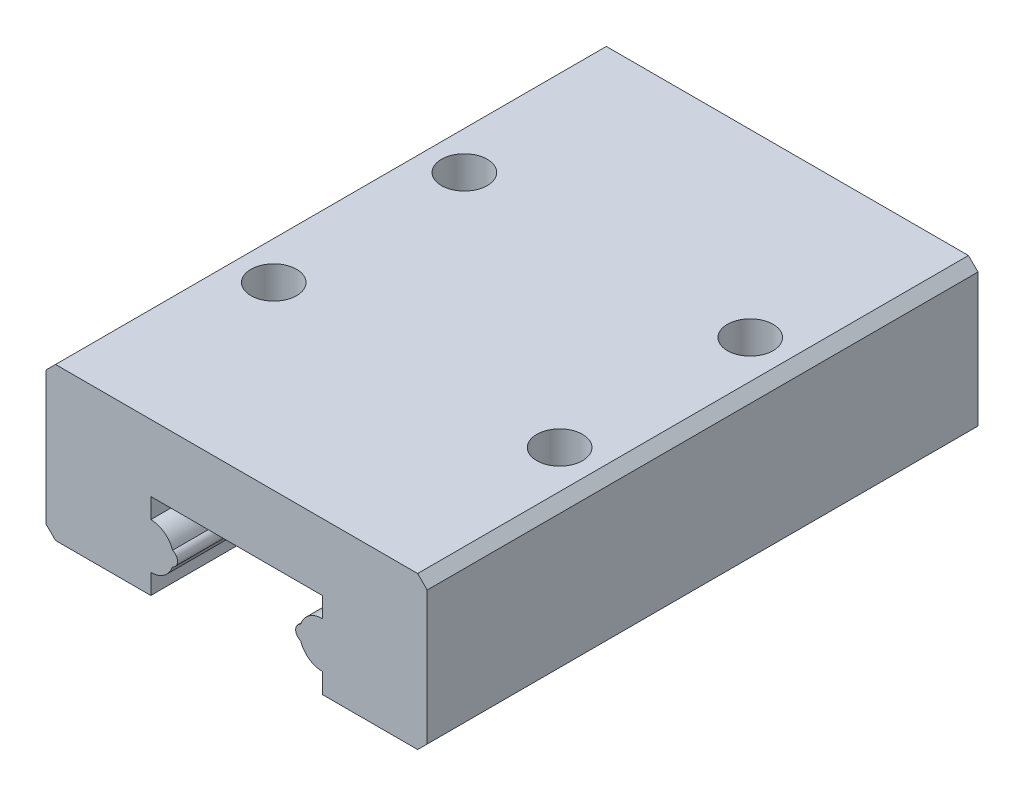
ISO-10303-21;
HEADER;
FILE_DESCRIPTION(('STEP AP214'),'2;1');
FILE_NAME('part.step','',(''),(''),'','','');
FILE_SCHEMA(('AUTOMOTIVE_DESIGN { 1 0 10303 214 1 1 1 1 }'));
ENDSEC;
DATA;
#1=APPLICATION_CONTEXT('core data for automotive mechanical design processes');
#2=APPLICATION_PROTOCOL_DEFINITION('international standard','automotive_design',2000,#1);
#3=PRODUCT_CONTEXT('',#1,'mechanical');
#4=PRODUCT('Part','Part','',(#3));
#5=PRODUCT_RELATED_PRODUCT_CATEGORY('part','',(#4));
#6=PRODUCT_DEFINITION_FORMATION('','',#4);
#7=PRODUCT_DEFINITION_CONTEXT('part definition',#1,'design');
#8=PRODUCT_DEFINITION('design','',#6,#7);
#9=PRODUCT_DEFINITION_SHAPE('','',#8);
#10=(LENGTH_UNIT() NAMED_UNIT(*) SI_UNIT(.MILLI.,.METRE.));
#11=(NAMED_UNIT(*) PLANE_ANGLE_UNIT() SI_UNIT($,.RADIAN.));
#12=(NAMED_UNIT(*) SI_UNIT($,.STERADIAN.) SOLID_ANGLE_UNIT());
#13=UNCERTAINTY_MEASURE_WITH_UNIT(LENGTH_MEASURE(1.E-05),#10,'distance_accuracy_value','');
#14=(GEOMETRIC_REPRESENTATION_CONTEXT(3) GLOBAL_UNCERTAINTY_ASSIGNED_CONTEXT((#13)) GLOBAL_UNIT_ASSIGNED_CONTEXT((#10,
#11,#12)) REPRESENTATION_CONTEXT('',''));
#15=CARTESIAN_POINT('',(0.,0.,0.));
#16=DIRECTION('',(0.,0.,1.));
#17=DIRECTION('',(1.,0.,0.));
#18=AXIS2_PLACEMENT_3D('',#15,#16,#17);
#19=CARTESIAN_POINT('',(-19.5,0.,-28.9));
#20=DIRECTION('',(0.707106781186547,0.707106781186548,0.));
#21=DIRECTION('',(-0.707106781186548,0.707106781186547,0.));
#22=AXIS2_PLACEMENT_3D('',#19,#20,#21);
#23=PLANE('',#22);
#24=DIRECTION('',(-0.707106781186548,0.707106781186547,0.));
#25=VECTOR('',#24,1.);
#26=CARTESIAN_POINT('',(-19.5,0.,0.));
#27=LINE('',#26,#25);
#28=CARTESIAN_POINT('',(-19.5,0.,0.));
#29=VERTEX_POINT('',#28);
#30=CARTESIAN_POINT('',(-20.,0.5,0.));
#31=VERTEX_POINT('',#30);
#32=EDGE_CURVE('E210',#29,#31,#27,.T.);
#33=ORIENTED_EDGE('',*,*,#32,.T.);
#34=DIRECTION('',(0.,0.,1.));
#35=VECTOR('',#34,1.);
#36=CARTESIAN_POINT('',(-20.,0.5,-28.9));
#37=LINE('',#36,#35);
#38=CARTESIAN_POINT('',(-20.,0.5,-28.9));
#39=VERTEX_POINT('',#38);
#40=EDGE_CURVE('E11',#39,#31,#37,.T.);
#41=ORIENTED_EDGE('',*,*,#40,.F.);
#42=DIRECTION('',(-0.707106781186548,0.707106781186547,0.));
#43=VECTOR('',#42,1.);
#44=CARTESIAN_POINT('',(-19.5,0.,-28.9));
#45=LINE('',#44,#43);
#46=CARTESIAN_POINT('',(-19.5,0.,-28.9));
#47=VERTEX_POINT('',#46);
#48=EDGE_CURVE('E260',#47,#39,#45,.T.);
#49=ORIENTED_EDGE('',*,*,#48,.F.);
#50=DIRECTION('',(0.,0.,1.));
#51=VECTOR('',#50,1.);
#52=CARTESIAN_POINT('',(-19.5,0.,-28.9));
#53=LINE('',#52,#51);
#54=EDGE_CURVE('E206',#47,#29,#53,.T.);
#55=ORIENTED_EDGE('',*,*,#54,.T.);
#56=EDGE_LOOP('',(#33,#41,#49,#55));
#57=FACE_BOUND('',#56,.T.);
#58=ADVANCED_FACE('F43',(#57),#23,.F.);
#59=CARTESIAN_POINT('',(-20.,0.5,-28.9));
#60=DIRECTION('',(1.,0.,0.));
#61=DIRECTION('',(0.,0.,-1.));
#62=AXIS2_PLACEMENT_3D('',#59,#60,#61);
#63=PLANE('',#62);
#64=DIRECTION('',(0.,1.,0.));
#65=VECTOR('',#64,1.);
#66=CARTESIAN_POINT('',(-20.,0.5,0.));
#67=LINE('',#66,#65);
#68=CARTESIAN_POINT('',(-20.,7.5,0.));
#69=VERTEX_POINT('',#68);
#70=EDGE_CURVE('E213',#31,#69,#67,.T.);
#71=ORIENTED_EDGE('',*,*,#70,.T.);
#72=DIRECTION('',(0.,0.,1.));
#73=VECTOR('',#72,1.);
#74=CARTESIAN_POINT('',(-20.,7.5,-28.9));
#75=LINE('',#74,#73);
#76=CARTESIAN_POINT('',(-20.,7.5,-28.9));
#77=VERTEX_POINT('',#76);
#78=EDGE_CURVE('E51',#77,#69,#75,.T.);
#79=ORIENTED_EDGE('',*,*,#78,.F.);
#80=DIRECTION('',(0.,1.,0.));
#81=VECTOR('',#80,1.);
#82=CARTESIAN_POINT('',(-20.,0.5,-28.9));
#83=LINE('',#82,#81);
#84=EDGE_CURVE('E134',#39,#77,#83,.T.);
#85=ORIENTED_EDGE('',*,*,#84,.F.);
#86=ORIENTED_EDGE('',*,*,#40,.T.);
#87=EDGE_LOOP('',(#71,#79,#85,#86));
#88=FACE_BOUND('',#87,.T.);
#89=ADVANCED_FACE('F303',(#88),#63,.F.);
#90=CARTESIAN_POINT('',(-19.5,8.,-28.9));
#91=DIRECTION('',(-0.707106781186547,0.707106781186547,0.));
#92=DIRECTION('',(-0.707106781186548,-0.707106781186548,0.));
#93=AXIS2_PLACEMENT_3D('',#90,#91,#92);
#94=PLANE('',#93);
#95=DIRECTION('',(-0.707106781186547,-0.707106781186547,0.));
#96=VECTOR('',#95,1.);
#97=CARTESIAN_POINT('',(-19.5,8.,0.));
#98=LINE('',#97,#96);
#99=CARTESIAN_POINT('',(-19.5,8.,0.));
#100=VERTEX_POINT('',#99);
#101=EDGE_CURVE('E217',#100,#69,#98,.T.);
#102=ORIENTED_EDGE('',*,*,#101,.F.);
#103=DIRECTION('',(0.,0.,1.));
#104=VECTOR('',#103,1.);
#105=CARTESIAN_POINT('',(-19.5,8.,-28.9));
#106=LINE('',#105,#104);
#107=CARTESIAN_POINT('',(-19.5,8.,-28.9));
#108=VERTEX_POINT('',#107);
#109=EDGE_CURVE('E296',#108,#100,#106,.T.);
#110=ORIENTED_EDGE('',*,*,#109,.F.);
#111=DIRECTION('',(-0.707106781186547,-0.707106781186547,0.));
#112=VECTOR('',#111,1.);
#113=CARTESIAN_POINT('',(-19.5,8.,-28.9));
#114=LINE('',#113,#112);
#115=EDGE_CURVE('E302',#108,#77,#114,.T.);
#116=ORIENTED_EDGE('',*,*,#115,.T.);
#117=ORIENTED_EDGE('',*,*,#78,.T.);
#118=EDGE_LOOP('',(#102,#110,#116,#117));
#119=FACE_BOUND('',#118,.T.);
#120=ADVANCED_FACE('F300',(#119),#94,.T.);
#121=CARTESIAN_POINT('',(-0.5,8.,-28.9));
#122=DIRECTION('',(0.,1.,0.));
#123=DIRECTION('',(-1.,0.,0.));
#124=AXIS2_PLACEMENT_3D('',#121,#122,#123);
#125=PLANE('',#124);
#126=CARTESIAN_POINT('',(-17.5,8.,-9.45));
#127=DIRECTION('',(0.,1.,0.));
#128=DIRECTION('',(-1.,0.,0.));
#129=AXIS2_PLACEMENT_3D('',#126,#127,#128);
#130=CIRCLE('',#129,1.2);
#131=CARTESIAN_POINT('',(-18.7,8.,-9.45));
#132=VERTEX_POINT('',#131);
#133=EDGE_CURVE('E541',#132,#132,#130,.T.);
#134=ORIENTED_EDGE('',*,*,#133,.F.);
#135=EDGE_LOOP('',(#134));
#136=FACE_BOUND('',#135,.T.);
#137=CARTESIAN_POINT('',(-2.5,8.,-9.45));
#138=DIRECTION('',(0.,1.,0.));
#139=DIRECTION('',(-1.,0.,0.));
#140=AXIS2_PLACEMENT_3D('',#137,#138,#139);
#141=CIRCLE('',#140,1.2);
#142=CARTESIAN_POINT('',(-3.7,8.,-9.45));
#143=VERTEX_POINT('',#142);
#144=EDGE_CURVE('E561',#143,#143,#141,.T.);
#145=ORIENTED_EDGE('',*,*,#144,.F.);
#146=EDGE_LOOP('',(#145));
#147=FACE_BOUND('',#146,.T.);
#148=CARTESIAN_POINT('',(-2.5,8.,-19.45));
#149=DIRECTION('',(0.,1.,0.));
#150=DIRECTION('',(-1.,0.,0.));
#151=AXIS2_PLACEMENT_3D('',#148,#149,#150);
#152=CIRCLE('',#151,1.2);
#153=CARTESIAN_POINT('',(-3.7,8.,-19.45));
#154=VERTEX_POINT('',#153);
#155=EDGE_CURVE('E552',#154,#154,#152,.T.);
#156=ORIENTED_EDGE('',*,*,#155,.F.);
#157=EDGE_LOOP('',(#156));
#158=FACE_BOUND('',#157,.T.);
#159=CARTESIAN_POINT('',(-17.5,8.,-19.45));
#160=DIRECTION('',(0.,1.,0.));
#161=DIRECTION('',(-1.,0.,0.));
#162=AXIS2_PLACEMENT_3D('',#159,#160,#161);
#163=CIRCLE('',#162,1.2);
#164=CARTESIAN_POINT('',(-18.7,8.,-19.45));
#165=VERTEX_POINT('',#164);
#166=EDGE_CURVE('E550',#165,#165,#163,.T.);
#167=ORIENTED_EDGE('',*,*,#166,.F.);
#168=EDGE_LOOP('',(#167));
#169=FACE_BOUND('',#168,.T.);
#170=DIRECTION('',(-1.,0.,0.));
#171=VECTOR('',#170,1.);
#172=CARTESIAN_POINT('',(-0.5,8.,0.));
#173=LINE('',#172,#171);
#174=CARTESIAN_POINT('',(-0.5,8.,0.));
#175=VERTEX_POINT('',#174);
#176=EDGE_CURVE('E220',#175,#100,#173,.T.);
#177=ORIENTED_EDGE('',*,*,#176,.F.);
#178=DIRECTION('',(0.,0.,1.));
#179=VECTOR('',#178,1.);
#180=CARTESIAN_POINT('',(-0.5,8.,-28.9));
#181=LINE('',#180,#179);
#182=CARTESIAN_POINT('',(-0.5,8.,-28.9));
#183=VERTEX_POINT('',#182);
#184=EDGE_CURVE('E294',#183,#175,#181,.T.);
#185=ORIENTED_EDGE('',*,*,#184,.F.);
#186=DIRECTION('',(-1.,0.,0.));
#187=VECTOR('',#186,1.);
#188=CARTESIAN_POINT('',(-0.5,8.,-28.9));
#189=LINE('',#188,#187);
#190=EDGE_CURVE('E314',#183,#108,#189,.T.);
#191=ORIENTED_EDGE('',*,*,#190,.T.);
#192=ORIENTED_EDGE('',*,*,#109,.T.);
#193=EDGE_LOOP('',(#177,#185,#191,#192));
#194=FACE_BOUND('',#193,.T.);
#195=ADVANCED_FACE('F311',(#136,#147,#158,#169,#194),#125,.T.);
#196=CARTESIAN_POINT('',(0.,7.5,-28.9));
#197=DIRECTION('',(0.707106781186548,0.707106781186547,0.));
#198=DIRECTION('',(-0.707106781186547,0.707106781186548,0.));
#199=AXIS2_PLACEMENT_3D('',#196,#197,#198);
#200=PLANE('',#199);
#201=DIRECTION('',(-0.707106781186547,0.707106781186548,0.));
#202=VECTOR('',#201,1.);
#203=CARTESIAN_POINT('',(0.,7.5,0.));
#204=LINE('',#203,#202);
#205=CARTESIAN_POINT('',(0.,7.5,0.));
#206=VERTEX_POINT('',#205);
#207=EDGE_CURVE('E223',#206,#175,#204,.T.);
#208=ORIENTED_EDGE('',*,*,#207,.F.);
#209=DIRECTION('',(0.,0.,1.));
#210=VECTOR('',#209,1.);
#211=CARTESIAN_POINT('',(0.,7.5,-28.9));
#212=LINE('',#211,#210);
#213=CARTESIAN_POINT('',(0.,7.5,-28.9));
#214=VERTEX_POINT('',#213);
#215=EDGE_CURVE('E292',#214,#206,#212,.T.);
#216=ORIENTED_EDGE('',*,*,#215,.F.);
#217=DIRECTION('',(-0.707106781186547,0.707106781186548,0.));
#218=VECTOR('',#217,1.);
#219=CARTESIAN_POINT('',(0.,7.5,-28.9));
#220=LINE('',#219,#218);
#221=EDGE_CURVE('E318',#214,#183,#220,.T.);
#222=ORIENTED_EDGE('',*,*,#221,.T.);
#223=ORIENTED_EDGE('',*,*,#184,.T.);
#224=EDGE_LOOP('',(#208,#216,#222,#223));
#225=FACE_BOUND('',#224,.T.);
#226=ADVANCED_FACE('F376',(#225),#200,.T.);
#227=CARTESIAN_POINT('',(0.,0.5,-28.9));
#228=DIRECTION('',(1.,0.,0.));
#229=DIRECTION('',(0.,0.,-1.));
#230=AXIS2_PLACEMENT_3D('',#227,#228,#229);
#231=PLANE('',#230);
#232=DIRECTION('',(0.,1.,0.));
#233=VECTOR('',#232,1.);
#234=CARTESIAN_POINT('',(0.,0.5,0.));
#235=LINE('',#234,#233);
#236=CARTESIAN_POINT('',(0.,0.5,0.));
#237=VERTEX_POINT('',#236);
#238=EDGE_CURVE('E226',#237,#206,#235,.T.);
#239=ORIENTED_EDGE('',*,*,#238,.F.);
#240=DIRECTION('',(0.,0.,1.));
#241=VECTOR('',#240,1.);
#242=CARTESIAN_POINT('',(0.,0.5,-28.9));
#243=LINE('',#242,#241);
#244=CARTESIAN_POINT('',(0.,0.5,-28.9));
#245=VERTEX_POINT('',#244);
#246=EDGE_CURVE('E290',#245,#237,#243,.T.);
#247=ORIENTED_EDGE('',*,*,#246,.F.);
#248=DIRECTION('',(0.,1.,0.));
#249=VECTOR('',#248,1.);
#250=CARTESIAN_POINT('',(0.,0.5,-28.9));
#251=LINE('',#250,#249);
#252=EDGE_CURVE('E324',#245,#214,#251,.T.);
#253=ORIENTED_EDGE('',*,*,#252,.T.);
#254=ORIENTED_EDGE('',*,*,#215,.T.);
#255=EDGE_LOOP('',(#239,#247,#253,#254));
#256=FACE_BOUND('',#255,.T.);
#257=ADVANCED_FACE('F380',(#256),#231,.T.);
#258=CARTESIAN_POINT('',(0.,0.5,-28.9));
#259=DIRECTION('',(-0.707106781186548,0.707106781186548,0.));
#260=DIRECTION('',(-0.707106781186548,-0.707106781186548,0.));
#261=AXIS2_PLACEMENT_3D('',#258,#259,#260);
#262=PLANE('',#261);
#263=DIRECTION('',(-0.707106781186548,-0.707106781186548,0.));
#264=VECTOR('',#263,1.);
#265=CARTESIAN_POINT('',(0.,0.5,0.));
#266=LINE('',#265,#264);
#267=CARTESIAN_POINT('',(-0.5,0.,0.));
#268=VERTEX_POINT('',#267);
#269=EDGE_CURVE('E229',#237,#268,#266,.T.);
#270=ORIENTED_EDGE('',*,*,#269,.T.);
#271=DIRECTION('',(0.,0.,1.));
#272=VECTOR('',#271,1.);
#273=CARTESIAN_POINT('',(-0.5,0.,-28.9));
#274=LINE('',#273,#272);
#275=CARTESIAN_POINT('',(-0.5,0.,-28.9));
#276=VERTEX_POINT('',#275);
#277=EDGE_CURVE('E287',#276,#268,#274,.T.);
#278=ORIENTED_EDGE('',*,*,#277,.F.);
#279=DIRECTION('',(-0.707106781186548,-0.707106781186548,0.));
#280=VECTOR('',#279,1.);
#281=CARTESIAN_POINT('',(0.,0.5,-28.9));
#282=LINE('',#281,#280);
#283=EDGE_CURVE('E327',#245,#276,#282,.T.);
#284=ORIENTED_EDGE('',*,*,#283,.F.);
#285=ORIENTED_EDGE('',*,*,#246,.T.);
#286=EDGE_LOOP('',(#270,#278,#284,#285));
#287=FACE_BOUND('',#286,.T.);
#288=ADVANCED_FACE('F384',(#287),#262,.F.);
#289=CARTESIAN_POINT('',(-0.5,0.,-28.9));
#290=DIRECTION('',(0.,1.,0.));
#291=DIRECTION('',(-1.,0.,0.));
#292=AXIS2_PLACEMENT_3D('',#289,#290,#291);
#293=PLANE('',#292);
#294=DIRECTION('',(-1.,0.,0.));
#295=VECTOR('',#294,1.);
#296=CARTESIAN_POINT('',(-0.5,0.,0.));
#297=LINE('',#296,#295);
#298=CARTESIAN_POINT('',(-5.5,0.,0.));
#299=VERTEX_POINT('',#298);
#300=EDGE_CURVE('E231',#268,#299,#297,.T.);
#301=ORIENTED_EDGE('',*,*,#300,.T.);
#302=DIRECTION('',(0.,0.,1.));
#303=VECTOR('',#302,1.);
#304=CARTESIAN_POINT('',(-5.5,0.,-28.9));
#305=LINE('',#304,#303);
#306=CARTESIAN_POINT('',(-5.5,0.,-28.9));
#307=VERTEX_POINT('',#306);
#308=EDGE_CURVE('E284',#307,#299,#305,.T.);
#309=ORIENTED_EDGE('',*,*,#308,.F.);
#310=DIRECTION('',(-1.,0.,0.));
#311=VECTOR('',#310,1.);
#312=CARTESIAN_POINT('',(-0.5,0.,-28.9));
#313=LINE('',#312,#311);
#314=EDGE_CURVE('E329',#276,#307,#313,.T.);
#315=ORIENTED_EDGE('',*,*,#314,.F.);
#316=ORIENTED_EDGE('',*,*,#277,.T.);
#317=EDGE_LOOP('',(#301,#309,#315,#316));
#318=FACE_BOUND('',#317,.T.);
#319=ADVANCED_FACE('F388',(#318),#293,.F.);
#320=CARTESIAN_POINT('',(-5.5,0.,-28.9));
#321=DIRECTION('',(1.,0.,0.));
#322=DIRECTION('',(0.,0.,-1.));
#323=AXIS2_PLACEMENT_3D('',#320,#321,#322);
#324=PLANE('',#323);
#325=DIRECTION('',(0.,1.,0.));
#326=VECTOR('',#325,1.);
#327=CARTESIAN_POINT('',(-5.5,0.,0.));
#328=LINE('',#327,#326);
#329=CARTESIAN_POINT('',(-5.5,1.05,0.));
#330=VERTEX_POINT('',#329);
#331=EDGE_CURVE('E233',#299,#330,#328,.T.);
#332=ORIENTED_EDGE('',*,*,#331,.T.);
#333=DIRECTION('',(0.,0.,1.));
#334=VECTOR('',#333,1.);
#335=CARTESIAN_POINT('',(-5.5,1.05,-28.9));
#336=LINE('',#335,#334);
#337=CARTESIAN_POINT('',(-5.5,1.05,-28.9));
#338=VERTEX_POINT('',#337);
#339=EDGE_CURVE('E281',#338,#330,#336,.T.);
#340=ORIENTED_EDGE('',*,*,#339,.F.);
#341=DIRECTION('',(0.,1.,0.));
#342=VECTOR('',#341,1.);
#343=CARTESIAN_POINT('',(-5.5,0.,-28.9));
#344=LINE('',#343,#342);
#345=EDGE_CURVE('E331',#307,#338,#344,.T.);
#346=ORIENTED_EDGE('',*,*,#345,.F.);
#347=ORIENTED_EDGE('',*,*,#308,.T.);
#348=EDGE_LOOP('',(#332,#340,#346,#347));
#349=FACE_BOUND('',#348,.T.);
#350=ADVANCED_FACE('F392',(#349),#324,.F.);
#351=CARTESIAN_POINT('',(-5.5,2.25,-28.9));
#352=DIRECTION('',(0.,0.,1.));
#353=DIRECTION('',(1.,0.,0.));
#354=AXIS2_PLACEMENT_3D('',#351,#352,#353);
#355=CYLINDRICAL_SURFACE('',#354,1.2);
#356=CARTESIAN_POINT('',(-5.5,2.25,0.));
#357=DIRECTION('',(0.,0.,-1.));
#358=DIRECTION('',(-1.,0.,0.));
#359=AXIS2_PLACEMENT_3D('',#356,#357,#358);
#360=CIRCLE('',#359,1.2);
#361=CARTESIAN_POINT('',(-6.64,1.8753001200961,0.));
#362=VERTEX_POINT('',#361);
#363=EDGE_CURVE('E235',#330,#362,#360,.T.);
#364=ORIENTED_EDGE('',*,*,#363,.T.);
#365=DIRECTION('',(0.,0.,1.));
#366=VECTOR('',#365,1.);
#367=CARTESIAN_POINT('',(-6.64,1.8753001200961,-28.9));
#368=LINE('',#367,#366);
#369=CARTESIAN_POINT('',(-6.64,1.8753001200961,-28.9));
#370=VERTEX_POINT('',#369);
#371=EDGE_CURVE('E278',#370,#362,#368,.T.);
#372=ORIENTED_EDGE('',*,*,#371,.F.);
#373=CARTESIAN_POINT('',(-5.5,2.25,-28.9));
#374=DIRECTION('',(0.,0.,-1.));
#375=DIRECTION('',(-1.,0.,0.));
#376=AXIS2_PLACEMENT_3D('',#373,#374,#375);
#377=CIRCLE('',#376,1.2);
#378=EDGE_CURVE('E333',#338,#370,#377,.T.);
#379=ORIENTED_EDGE('',*,*,#378,.F.);
#380=ORIENTED_EDGE('',*,*,#339,.T.);
#381=EDGE_LOOP('',(#364,#372,#379,#380));
#382=FACE_BOUND('',#381,.T.);
#383=ADVANCED_FACE('F396',(#382),#355,.T.);
#384=CARTESIAN_POINT('',(-6.5,2.25,-28.9));
#385=DIRECTION('',(0.,0.,1.));
#386=DIRECTION('',(1.,0.,0.));
#387=AXIS2_PLACEMENT_3D('',#384,#385,#386);
#388=CYLINDRICAL_SURFACE('',#387,0.399999999999999);
#389=CARTESIAN_POINT('',(-6.5,2.25,0.));
#390=DIRECTION('',(0.,0.,-1.));
#391=DIRECTION('',(-1.,0.,0.));
#392=AXIS2_PLACEMENT_3D('',#389,#390,#391);
#393=CIRCLE('',#392,0.399999999999999);
#394=CARTESIAN_POINT('',(-6.64,2.6246998799039,0.));
#395=VERTEX_POINT('',#394);
#396=EDGE_CURVE('E237',#362,#395,#393,.T.);
#397=ORIENTED_EDGE('',*,*,#396,.T.);
#398=DIRECTION('',(0.,0.,1.));
#399=VECTOR('',#398,1.);
#400=CARTESIAN_POINT('',(-6.64,2.6246998799039,-28.9));
#401=LINE('',#400,#399);
#402=CARTESIAN_POINT('',(-6.64,2.6246998799039,-28.9));
#403=VERTEX_POINT('',#402);
#404=EDGE_CURVE('E275',#403,#395,#401,.T.);
#405=ORIENTED_EDGE('',*,*,#404,.F.);
#406=CARTESIAN_POINT('',(-6.5,2.25,-28.9));
#407=DIRECTION('',(0.,0.,-1.));
#408=DIRECTION('',(-1.,0.,0.));
#409=AXIS2_PLACEMENT_3D('',#406,#407,#408);
#410=CIRCLE('',#409,0.399999999999999);
#411=EDGE_CURVE('E335',#370,#403,#410,.T.);
#412=ORIENTED_EDGE('',*,*,#411,.F.);
#413=ORIENTED_EDGE('',*,*,#371,.T.);
#414=EDGE_LOOP('',(#397,#405,#412,#413));
#415=FACE_BOUND('',#414,.T.);
#416=ADVANCED_FACE('F400',(#415),#388,.T.);
#417=CARTESIAN_POINT('',(-5.5,2.25,-28.9));
#418=DIRECTION('',(0.,0.,1.));
#419=DIRECTION('',(1.,0.,0.));
#420=AXIS2_PLACEMENT_3D('',#417,#418,#419);
#421=CYLINDRICAL_SURFACE('',#420,1.2);
#422=CARTESIAN_POINT('',(-5.5,2.25,0.));
#423=DIRECTION('',(0.,0.,-1.));
#424=DIRECTION('',(-1.,0.,0.));
#425=AXIS2_PLACEMENT_3D('',#422,#423,#424);
#426=CIRCLE('',#425,1.2);
#427=CARTESIAN_POINT('',(-5.5,3.45,0.));
#428=VERTEX_POINT('',#427);
#429=EDGE_CURVE('E239',#395,#428,#426,.T.);
#430=ORIENTED_EDGE('',*,*,#429,.T.);
#431=DIRECTION('',(0.,0.,1.));
#432=VECTOR('',#431,1.);
#433=CARTESIAN_POINT('',(-5.5,3.45,-28.9));
#434=LINE('',#433,#432);
#435=CARTESIAN_POINT('',(-5.5,3.45,-28.9));
#436=VERTEX_POINT('',#435);
#437=EDGE_CURVE('E272',#436,#428,#434,.T.);
#438=ORIENTED_EDGE('',*,*,#437,.F.);
#439=CARTESIAN_POINT('',(-5.5,2.25,-28.9));
#440=DIRECTION('',(0.,0.,-1.));
#441=DIRECTION('',(-1.,0.,0.));
#442=AXIS2_PLACEMENT_3D('',#439,#440,#441);
#443=CIRCLE('',#442,1.2);
#444=EDGE_CURVE('E337',#403,#436,#443,.T.);
#445=ORIENTED_EDGE('',*,*,#444,.F.);
#446=ORIENTED_EDGE('',*,*,#404,.T.);
#447=EDGE_LOOP('',(#430,#438,#445,#446));
#448=FACE_BOUND('',#447,.T.);
#449=ADVANCED_FACE('F404',(#448),#421,.T.);
#450=CARTESIAN_POINT('',(-5.5,3.45,-28.9));
#451=DIRECTION('',(1.,0.,0.));
#452=DIRECTION('',(0.,0.,-1.));
#453=AXIS2_PLACEMENT_3D('',#450,#451,#452);
#454=PLANE('',#453);
#455=DIRECTION('',(0.,1.,0.));
#456=VECTOR('',#455,1.);
#457=CARTESIAN_POINT('',(-5.5,3.45,0.));
#458=LINE('',#457,#456);
#459=CARTESIAN_POINT('',(-5.5,4.5,0.));
#460=VERTEX_POINT('',#459);
#461=EDGE_CURVE('E241',#428,#460,#458,.T.);
#462=ORIENTED_EDGE('',*,*,#461,.T.);
#463=DIRECTION('',(0.,0.,1.));
#464=VECTOR('',#463,1.);
#465=CARTESIAN_POINT('',(-5.5,4.5,-28.9));
#466=LINE('',#465,#464);
#467=CARTESIAN_POINT('',(-5.5,4.5,-28.9));
#468=VERTEX_POINT('',#467);
#469=EDGE_CURVE('E270',#468,#460,#466,.T.);
#470=ORIENTED_EDGE('',*,*,#469,.F.);
#471=DIRECTION('',(0.,1.,0.));
#472=VECTOR('',#471,1.);
#473=CARTESIAN_POINT('',(-5.5,3.45,-28.9));
#474=LINE('',#473,#472);
#475=EDGE_CURVE('E339',#436,#468,#474,.T.);
#476=ORIENTED_EDGE('',*,*,#475,.F.);
#477=ORIENTED_EDGE('',*,*,#437,.T.);
#478=EDGE_LOOP('',(#462,#470,#476,#477));
#479=FACE_BOUND('',#478,.T.);
#480=ADVANCED_FACE('F408',(#479),#454,.F.);
#481=CARTESIAN_POINT('',(-14.5,4.5,-28.9));
#482=DIRECTION('',(0.,-1.,0.));
#483=DIRECTION('',(0.,0.,-1.));
#484=AXIS2_PLACEMENT_3D('',#481,#482,#483);
#485=PLANE('',#484);
#486=DIRECTION('',(1.,0.,0.));
#487=VECTOR('',#486,1.);
#488=CARTESIAN_POINT('',(-14.5,4.5,0.));
#489=LINE('',#488,#487);
#490=CARTESIAN_POINT('',(-14.5,4.5,0.));
#491=VERTEX_POINT('',#490);
#492=EDGE_CURVE('E244',#491,#460,#489,.T.);
#493=ORIENTED_EDGE('',*,*,#492,.F.);
#494=DIRECTION('',(0.,0.,1.));
#495=VECTOR('',#494,1.);
#496=CARTESIAN_POINT('',(-14.5,4.5,-28.9));
#497=LINE('',#496,#495);
#498=CARTESIAN_POINT('',(-14.5,4.5,-28.9));
#499=VERTEX_POINT('',#498);
#500=EDGE_CURVE('E268',#499,#491,#497,.T.);
#501=ORIENTED_EDGE('',*,*,#500,.F.);
#502=DIRECTION('',(1.,0.,0.));
#503=VECTOR('',#502,1.);
#504=CARTESIAN_POINT('',(-14.5,4.5,-28.9));
#505=LINE('',#504,#503);
#506=EDGE_CURVE('E341',#499,#468,#505,.T.);
#507=ORIENTED_EDGE('',*,*,#506,.T.);
#508=ORIENTED_EDGE('',*,*,#469,.T.);
#509=EDGE_LOOP('',(#493,#501,#507,#508));
#510=FACE_BOUND('',#509,.T.);
#511=ADVANCED_FACE('F412',(#510),#485,.T.);
#512=CARTESIAN_POINT('',(-14.5,3.45,-28.9));
#513=DIRECTION('',(1.,0.,0.));
#514=DIRECTION('',(0.,0.,-1.));
#515=AXIS2_PLACEMENT_3D('',#512,#513,#514);
#516=PLANE('',#515);
#517=DIRECTION('',(0.,1.,0.));
#518=VECTOR('',#517,1.);
#519=CARTESIAN_POINT('',(-14.5,3.45,0.));
#520=LINE('',#519,#518);
#521=CARTESIAN_POINT('',(-14.5,3.45,0.));
#522=VERTEX_POINT('',#521);
#523=EDGE_CURVE('E247',#522,#491,#520,.T.);
#524=ORIENTED_EDGE('',*,*,#523,.F.);
#525=DIRECTION('',(0.,0.,1.));
#526=VECTOR('',#525,1.);
#527=CARTESIAN_POINT('',(-14.5,3.45,-28.9));
#528=LINE('',#527,#526);
#529=CARTESIAN_POINT('',(-14.5,3.45,-28.9));
#530=VERTEX_POINT('',#529);
#531=EDGE_CURVE('E266',#530,#522,#528,.T.);
#532=ORIENTED_EDGE('',*,*,#531,.F.);
#533=DIRECTION('',(0.,1.,0.));
#534=VECTOR('',#533,1.);
#535=CARTESIAN_POINT('',(-14.5,3.45,-28.9));
#536=LINE('',#535,#534);
#537=EDGE_CURVE('E344',#530,#499,#536,.T.);
#538=ORIENTED_EDGE('',*,*,#537,.T.);
#539=ORIENTED_EDGE('',*,*,#500,.T.);
#540=EDGE_LOOP('',(#524,#532,#538,#539));
#541=FACE_BOUND('',#540,.T.);
#542=ADVANCED_FACE('F416',(#541),#516,.T.);
#543=CARTESIAN_POINT('',(-14.5,2.25,-28.9));
#544=DIRECTION('',(0.,0.,1.));
#545=DIRECTION('',(1.,0.,0.));
#546=AXIS2_PLACEMENT_3D('',#543,#544,#545);
#547=CYLINDRICAL_SURFACE('',#546,1.2);
#548=CARTESIAN_POINT('',(-14.5,2.25,0.));
#549=DIRECTION('',(0.,0.,1.));
#550=DIRECTION('',(1.,0.,0.));
#551=AXIS2_PLACEMENT_3D('',#548,#549,#550);
#552=CIRCLE('',#551,1.2);
#553=CARTESIAN_POINT('',(-13.36,2.6246998799039,0.));
#554=VERTEX_POINT('',#553);
#555=EDGE_CURVE('E250',#554,#522,#552,.T.);
#556=ORIENTED_EDGE('',*,*,#555,.F.);
#557=DIRECTION('',(0.,0.,1.));
#558=VECTOR('',#557,1.);
#559=CARTESIAN_POINT('',(-13.36,2.6246998799039,-28.9));
#560=LINE('',#559,#558);
#561=CARTESIAN_POINT('',(-13.36,2.6246998799039,-28.9));
#562=VERTEX_POINT('',#561);
#563=EDGE_CURVE('E264',#562,#554,#560,.T.);
#564=ORIENTED_EDGE('',*,*,#563,.F.);
#565=CARTESIAN_POINT('',(-14.5,2.25,-28.9));
#566=DIRECTION('',(0.,0.,1.));
#567=DIRECTION('',(1.,0.,0.));
#568=AXIS2_PLACEMENT_3D('',#565,#566,#567);
#569=CIRCLE('',#568,1.2);
#570=EDGE_CURVE('E347',#562,#530,#569,.T.);
#571=ORIENTED_EDGE('',*,*,#570,.T.);
#572=ORIENTED_EDGE('',*,*,#531,.T.);
#573=EDGE_LOOP('',(#556,#564,#571,#572));
#574=FACE_BOUND('',#573,.T.);
#575=ADVANCED_FACE('F420',(#574),#547,.T.);
#576=CARTESIAN_POINT('',(-13.5,2.25,-28.9));
#577=DIRECTION('',(0.,0.,1.));
#578=DIRECTION('',(1.,0.,0.));
#579=AXIS2_PLACEMENT_3D('',#576,#577,#578);
#580=CYLINDRICAL_SURFACE('',#579,0.4);
#581=CARTESIAN_POINT('',(-13.5,2.25,0.));
#582=DIRECTION('',(0.,0.,1.));
#583=DIRECTION('',(1.,0.,0.));
#584=AXIS2_PLACEMENT_3D('',#581,#582,#583);
#585=CIRCLE('',#584,0.4);
#586=CARTESIAN_POINT('',(-13.36,1.87530012009609,0.));
#587=VERTEX_POINT('',#586);
#588=EDGE_CURVE('E253',#587,#554,#585,.T.);
#589=ORIENTED_EDGE('',*,*,#588,.F.);
#590=DIRECTION('',(0.,0.,1.));
#591=VECTOR('',#590,1.);
#592=CARTESIAN_POINT('',(-13.36,1.87530012009609,-28.9));
#593=LINE('',#592,#591);
#594=CARTESIAN_POINT('',(-13.36,1.87530012009609,-28.9));
#595=VERTEX_POINT('',#594);
#596=EDGE_CURVE('E195',#595,#587,#593,.T.);
#597=ORIENTED_EDGE('',*,*,#596,.F.);
#598=CARTESIAN_POINT('',(-13.5,2.25,-28.9));
#599=DIRECTION('',(0.,0.,1.));
#600=DIRECTION('',(1.,0.,0.));
#601=AXIS2_PLACEMENT_3D('',#598,#599,#600);
#602=CIRCLE('',#601,0.4);
#603=EDGE_CURVE('E202',#595,#562,#602,.T.);
#604=ORIENTED_EDGE('',*,*,#603,.T.);
#605=ORIENTED_EDGE('',*,*,#563,.T.);
#606=EDGE_LOOP('',(#589,#597,#604,#605));
#607=FACE_BOUND('',#606,.T.);
#608=ADVANCED_FACE('F351',(#607),#580,.T.);
#609=CARTESIAN_POINT('',(-14.5,2.25,-28.9));
#610=DIRECTION('',(0.,0.,1.));
#611=DIRECTION('',(1.,0.,0.));
#612=AXIS2_PLACEMENT_3D('',#609,#610,#611);
#613=CYLINDRICAL_SURFACE('',#612,1.2);
#614=CARTESIAN_POINT('',(-14.5,2.25,0.));
#615=DIRECTION('',(0.,0.,1.));
#616=DIRECTION('',(1.,0.,0.));
#617=AXIS2_PLACEMENT_3D('',#614,#615,#616);
#618=CIRCLE('',#617,1.2);
#619=CARTESIAN_POINT('',(-14.5,1.05,0.));
#620=VERTEX_POINT('',#619);
#621=EDGE_CURVE('E190',#620,#587,#618,.T.);
#622=ORIENTED_EDGE('',*,*,#621,.F.);
#623=DIRECTION('',(0.,0.,1.));
#624=VECTOR('',#623,1.);
#625=CARTESIAN_POINT('',(-14.5,1.05,-28.9));
#626=LINE('',#625,#624);
#627=CARTESIAN_POINT('',(-14.5,1.05,-28.9));
#628=VERTEX_POINT('',#627);
#629=EDGE_CURVE('E185',#628,#620,#626,.T.);
#630=ORIENTED_EDGE('',*,*,#629,.F.);
#631=CARTESIAN_POINT('',(-14.5,2.25,-28.9));
#632=DIRECTION('',(0.,0.,1.));
#633=DIRECTION('',(1.,0.,0.));
#634=AXIS2_PLACEMENT_3D('',#631,#632,#633);
#635=CIRCLE('',#634,1.2);
#636=EDGE_CURVE('E188',#628,#595,#635,.T.);
#637=ORIENTED_EDGE('',*,*,#636,.T.);
#638=ORIENTED_EDGE('',*,*,#596,.T.);
#639=EDGE_LOOP('',(#622,#630,#637,#638));
#640=FACE_BOUND('',#639,.T.);
#641=ADVANCED_FACE('F187',(#640),#613,.T.);
#642=CARTESIAN_POINT('',(-14.5,0.,-28.9));
#643=DIRECTION('',(1.,0.,0.));
#644=DIRECTION('',(0.,0.,-1.));
#645=AXIS2_PLACEMENT_3D('',#642,#643,#644);
#646=PLANE('',#645);
#647=DIRECTION('',(0.,1.,0.));
#648=VECTOR('',#647,1.);
#649=CARTESIAN_POINT('',(-14.5,0.,0.));
#650=LINE('',#649,#648);
#651=CARTESIAN_POINT('',(-14.5,0.,0.));
#652=VERTEX_POINT('',#651);
#653=EDGE_CURVE('E257',#652,#620,#650,.T.);
#654=ORIENTED_EDGE('',*,*,#653,.F.);
#655=DIRECTION('',(0.,0.,1.));
#656=VECTOR('',#655,1.);
#657=CARTESIAN_POINT('',(-14.5,0.,-28.9));
#658=LINE('',#657,#656);
#659=CARTESIAN_POINT('',(-14.5,0.,-28.9));
#660=VERTEX_POINT('',#659);
#661=EDGE_CURVE('E123',#660,#652,#658,.T.);
#662=ORIENTED_EDGE('',*,*,#661,.F.);
#663=DIRECTION('',(0.,1.,0.));
#664=VECTOR('',#663,1.);
#665=CARTESIAN_POINT('',(-14.5,0.,-28.9));
#666=LINE('',#665,#664);
#667=EDGE_CURVE('E199',#660,#628,#666,.T.);
#668=ORIENTED_EDGE('',*,*,#667,.T.);
#669=ORIENTED_EDGE('',*,*,#629,.T.);
#670=EDGE_LOOP('',(#654,#662,#668,#669));
#671=FACE_BOUND('',#670,.T.);
#672=ADVANCED_FACE('F204',(#671),#646,.T.);
#673=CARTESIAN_POINT('',(-14.5,0.,-28.9));
#674=DIRECTION('',(0.,1.,0.));
#675=DIRECTION('',(-1.,0.,0.));
#676=AXIS2_PLACEMENT_3D('',#673,#674,#675);
#677=PLANE('',#676);
#678=DIRECTION('',(-1.,0.,0.));
#679=VECTOR('',#678,1.);
#680=CARTESIAN_POINT('',(-14.5,0.,0.));
#681=LINE('',#680,#679);
#682=EDGE_CURVE('E126',#652,#29,#681,.T.);
#683=ORIENTED_EDGE('',*,*,#682,.T.);
#684=ORIENTED_EDGE('',*,*,#54,.F.);
#685=DIRECTION('',(-1.,0.,0.));
#686=VECTOR('',#685,1.);
#687=CARTESIAN_POINT('',(-14.5,0.,-28.9));
#688=LINE('',#687,#686);
#689=EDGE_CURVE('E59',#660,#47,#688,.T.);
#690=ORIENTED_EDGE('',*,*,#689,.F.);
#691=ORIENTED_EDGE('',*,*,#661,.T.);
#692=EDGE_LOOP('',(#683,#684,#690,#691));
#693=FACE_BOUND('',#692,.T.);
#694=ADVANCED_FACE('F355',(#693),#677,.F.);
#695=CARTESIAN_POINT('',(-5.5,2.25,-28.9));
#696=DIRECTION('',(0.,0.,-1.));
#697=DIRECTION('',(-1.,0.,0.));
#698=AXIS2_PLACEMENT_3D('',#695,#696,#697);
#699=PLANE('',#698);
#700=ORIENTED_EDGE('',*,*,#48,.T.);
#701=ORIENTED_EDGE('',*,*,#84,.T.);
#702=ORIENTED_EDGE('',*,*,#115,.F.);
#703=ORIENTED_EDGE('',*,*,#190,.F.);
#704=ORIENTED_EDGE('',*,*,#221,.F.);
#705=ORIENTED_EDGE('',*,*,#252,.F.);
#706=ORIENTED_EDGE('',*,*,#283,.T.);
#707=ORIENTED_EDGE('',*,*,#314,.T.);
#708=ORIENTED_EDGE('',*,*,#345,.T.);
#709=ORIENTED_EDGE('',*,*,#378,.T.);
#710=ORIENTED_EDGE('',*,*,#411,.T.);
#711=ORIENTED_EDGE('',*,*,#444,.T.);
#712=ORIENTED_EDGE('',*,*,#475,.T.);
#713=ORIENTED_EDGE('',*,*,#506,.F.);
#714=ORIENTED_EDGE('',*,*,#537,.F.);
#715=ORIENTED_EDGE('',*,*,#570,.F.);
#716=ORIENTED_EDGE('',*,*,#603,.F.);
#717=ORIENTED_EDGE('',*,*,#636,.F.);
#718=ORIENTED_EDGE('',*,*,#667,.F.);
#719=ORIENTED_EDGE('',*,*,#689,.T.);
#720=EDGE_LOOP('',(#700,#701,#702,#703,#704,#705,#706,#707,#708,#709,#710,#711,#712,#713,#714,
#715,#716,#717,#718,#719));
#721=FACE_BOUND('',#720,.T.);
#722=ADVANCED_FACE('F198',(#721),#699,.T.);
#723=CARTESIAN_POINT('',(-5.5,2.25,0.));
#724=DIRECTION('',(0.,0.,-1.));
#725=DIRECTION('',(-1.,0.,0.));
#726=AXIS2_PLACEMENT_3D('',#723,#724,#725);
#727=PLANE('',#726);
#728=ORIENTED_EDGE('',*,*,#32,.F.);
#729=ORIENTED_EDGE('',*,*,#682,.F.);
#730=ORIENTED_EDGE('',*,*,#653,.T.);
#731=ORIENTED_EDGE('',*,*,#621,.T.);
#732=ORIENTED_EDGE('',*,*,#588,.T.);
#733=ORIENTED_EDGE('',*,*,#555,.T.);
#734=ORIENTED_EDGE('',*,*,#523,.T.);
#735=ORIENTED_EDGE('',*,*,#492,.T.);
#736=ORIENTED_EDGE('',*,*,#461,.F.);
#737=ORIENTED_EDGE('',*,*,#429,.F.);
#738=ORIENTED_EDGE('',*,*,#396,.F.);
#739=ORIENTED_EDGE('',*,*,#363,.F.);
#740=ORIENTED_EDGE('',*,*,#331,.F.);
#741=ORIENTED_EDGE('',*,*,#300,.F.);
#742=ORIENTED_EDGE('',*,*,#269,.F.);
#743=ORIENTED_EDGE('',*,*,#238,.T.);
#744=ORIENTED_EDGE('',*,*,#207,.T.);
#745=ORIENTED_EDGE('',*,*,#176,.T.);
#746=ORIENTED_EDGE('',*,*,#101,.T.);
#747=ORIENTED_EDGE('',*,*,#70,.F.);
#748=EDGE_LOOP('',(#728,#729,#730,#731,#732,#733,#734,#735,#736,#737,#738,#739,#740,#741,#742,
#743,#744,#745,#746,#747));
#749=FACE_BOUND('',#748,.T.);
#750=ADVANCED_FACE('F307',(#749),#727,.F.);
#751=CARTESIAN_POINT('',(-17.5,3.,-19.45));
#752=DIRECTION('',(0.,1.,0.));
#753=DIRECTION('',(-1.,0.,0.));
#754=AXIS2_PLACEMENT_3D('',#751,#752,#753);
#755=CYLINDRICAL_SURFACE('',#754,1.2);
#756=CARTESIAN_POINT('',(-17.5,3.,-19.45));
#757=DIRECTION('',(0.,1.,0.));
#758=DIRECTION('',(-1.,0.,0.));
#759=AXIS2_PLACEMENT_3D('',#756,#757,#758);
#760=CIRCLE('',#759,1.2);
#761=CARTESIAN_POINT('',(-18.7,3.,-19.45));
#762=VERTEX_POINT('',#761);
#763=EDGE_CURVE('E214',#762,#762,#760,.T.);
#764=ORIENTED_EDGE('',*,*,#763,.F.);
#765=EDGE_LOOP('',(#764));
#766=FACE_BOUND('',#765,.T.);
#767=ORIENTED_EDGE('',*,*,#166,.T.);
#768=EDGE_LOOP('',(#767));
#769=FACE_BOUND('',#768,.T.);
#770=ADVANCED_FACE('F457',(#766,#769),#755,.F.);
#771=CARTESIAN_POINT('',(-17.5,3.,-19.45));
#772=DIRECTION('',(0.,1.,0.));
#773=DIRECTION('',(-1.,0.,0.));
#774=AXIS2_PLACEMENT_3D('',#771,#772,#773);
#775=PLANE('',#774);
#776=ORIENTED_EDGE('',*,*,#763,.T.);
#777=EDGE_LOOP('',(#776));
#778=FACE_BOUND('',#777,.T.);
#779=ADVANCED_FACE('F465',(#778),#775,.T.);
#780=CARTESIAN_POINT('',(-2.5,3.,-19.45));
#781=DIRECTION('',(0.,1.,0.));
#782=DIRECTION('',(-1.,0.,0.));
#783=AXIS2_PLACEMENT_3D('',#780,#781,#782);
#784=CYLINDRICAL_SURFACE('',#783,1.2);
#785=CARTESIAN_POINT('',(-2.5,3.,-19.45));
#786=DIRECTION('',(0.,1.,0.));
#787=DIRECTION('',(-1.,0.,0.));
#788=AXIS2_PLACEMENT_3D('',#785,#786,#787);
#789=CIRCLE('',#788,1.2);
#790=CARTESIAN_POINT('',(-3.7,3.,-19.45));
#791=VERTEX_POINT('',#790);
#792=EDGE_CURVE('E556',#791,#791,#789,.T.);
#793=ORIENTED_EDGE('',*,*,#792,.F.);
#794=EDGE_LOOP('',(#793));
#795=FACE_BOUND('',#794,.T.);
#796=ORIENTED_EDGE('',*,*,#155,.T.);
#797=EDGE_LOOP('',(#796));
#798=FACE_BOUND('',#797,.T.);
#799=ADVANCED_FACE('F475',(#795,#798),#784,.F.);
#800=CARTESIAN_POINT('',(-2.5,3.,-19.45));
#801=DIRECTION('',(0.,1.,0.));
#802=DIRECTION('',(-1.,0.,0.));
#803=AXIS2_PLACEMENT_3D('',#800,#801,#802);
#804=PLANE('',#803);
#805=ORIENTED_EDGE('',*,*,#792,.T.);
#806=EDGE_LOOP('',(#805));
#807=FACE_BOUND('',#806,.T.);
#808=ADVANCED_FACE('F485',(#807),#804,.T.);
#809=CARTESIAN_POINT('',(-2.5,3.,-9.45));
#810=DIRECTION('',(0.,1.,0.));
#811=DIRECTION('',(-1.,0.,0.));
#812=AXIS2_PLACEMENT_3D('',#809,#810,#811);
#813=CYLINDRICAL_SURFACE('',#812,1.2);
#814=CARTESIAN_POINT('',(-2.5,3.,-9.45));
#815=DIRECTION('',(0.,1.,0.));
#816=DIRECTION('',(-1.,0.,0.));
#817=AXIS2_PLACEMENT_3D('',#814,#815,#816);
#818=CIRCLE('',#817,1.2);
#819=CARTESIAN_POINT('',(-3.7,3.,-9.45));
#820=VERTEX_POINT('',#819);
#821=EDGE_CURVE('E544',#820,#820,#818,.T.);
#822=ORIENTED_EDGE('',*,*,#821,.F.);
#823=EDGE_LOOP('',(#822));
#824=FACE_BOUND('',#823,.T.);
#825=ORIENTED_EDGE('',*,*,#144,.T.);
#826=EDGE_LOOP('',(#825));
#827=FACE_BOUND('',#826,.T.);
#828=ADVANCED_FACE('F495',(#824,#827),#813,.F.);
#829=CARTESIAN_POINT('',(-2.5,3.,-9.45));
#830=DIRECTION('',(0.,1.,0.));
#831=DIRECTION('',(-1.,0.,0.));
#832=AXIS2_PLACEMENT_3D('',#829,#830,#831);
#833=PLANE('',#832);
#834=ORIENTED_EDGE('',*,*,#821,.T.);
#835=EDGE_LOOP('',(#834));
#836=FACE_BOUND('',#835,.T.);
#837=ADVANCED_FACE('F505',(#836),#833,.T.);
#838=CARTESIAN_POINT('',(-17.5,3.,-9.45));
#839=DIRECTION('',(0.,1.,0.));
#840=DIRECTION('',(-1.,0.,0.));
#841=AXIS2_PLACEMENT_3D('',#838,#839,#840);
#842=CYLINDRICAL_SURFACE('',#841,1.2);
#843=CARTESIAN_POINT('',(-17.5,3.,-9.45));
#844=DIRECTION('',(0.,1.,0.));
#845=DIRECTION('',(-1.,0.,0.));
#846=AXIS2_PLACEMENT_3D('',#843,#844,#845);
#847=CIRCLE('',#846,1.2);
#848=CARTESIAN_POINT('',(-18.7,3.,-9.45));
#849=VERTEX_POINT('',#848);
#850=EDGE_CURVE('E540',#849,#849,#847,.T.);
#851=ORIENTED_EDGE('',*,*,#850,.F.);
#852=EDGE_LOOP('',(#851));
#853=FACE_BOUND('',#852,.T.);
#854=ORIENTED_EDGE('',*,*,#133,.T.);
#855=EDGE_LOOP('',(#854));
#856=FACE_BOUND('',#855,.T.);
#857=ADVANCED_FACE('F515',(#853,#856),#842,.F.);
#858=CARTESIAN_POINT('',(-17.5,3.,-9.45));
#859=DIRECTION('',(0.,1.,0.));
#860=DIRECTION('',(-1.,0.,0.));
#861=AXIS2_PLACEMENT_3D('',#858,#859,#860);
#862=PLANE('',#861);
#863=ORIENTED_EDGE('',*,*,#850,.T.);
#864=EDGE_LOOP('',(#863));
#865=FACE_BOUND('',#864,.T.);
#866=ADVANCED_FACE('F525',(#865),#862,.T.);
#867=CLOSED_SHELL('',(#58,#89,#120,#195,#226,#257,#288,#319,#350,#383,#416,#449,#480,#511,#542,
#575,#608,#641,#672,#694,#722,#750,#770,#779,#799,#808,#828,#837,#857,#866));
#868=MANIFOLD_SOLID_BREP('B2',#867);
#869=ADVANCED_BREP_SHAPE_REPRESENTATION('',(#18,#868),#14);
#870=SHAPE_DEFINITION_REPRESENTATION(#9,#869);
ENDSEC;
END-ISO-10303-21;
